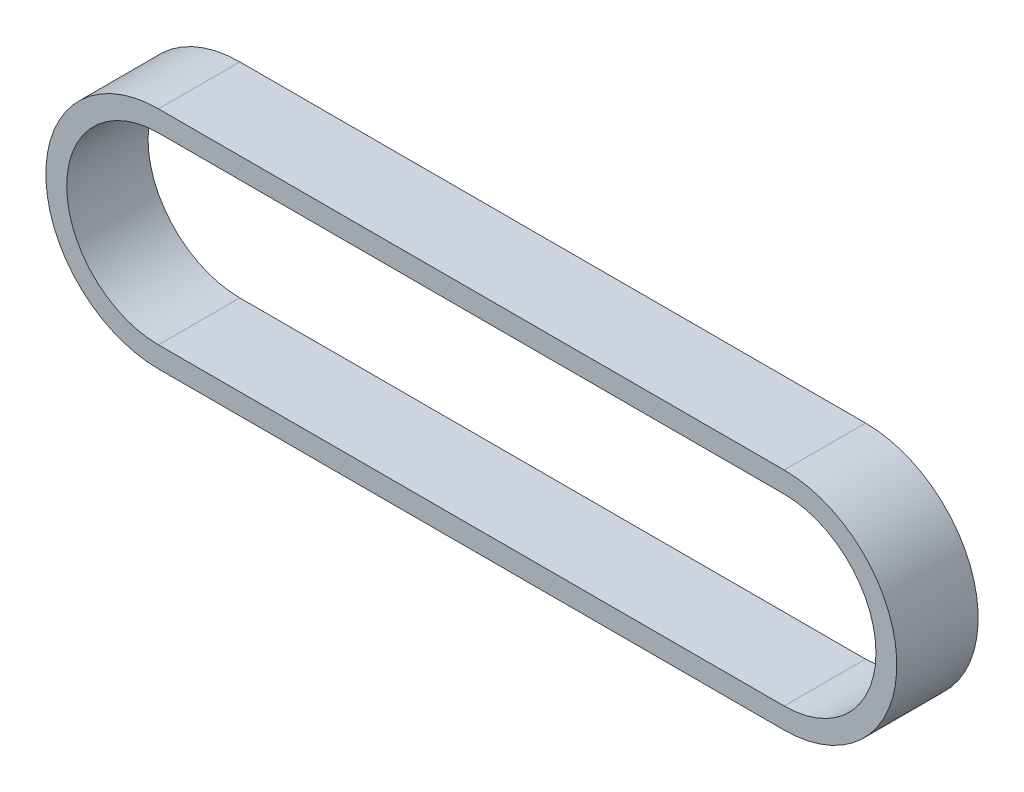
ISO-10303-21;
HEADER;
FILE_DESCRIPTION(('STEP AP214'),'2;1');
FILE_NAME('part.step','',(''),(''),'','','');
FILE_SCHEMA(('AUTOMOTIVE_DESIGN { 1 0 10303 214 1 1 1 1 }'));
ENDSEC;
DATA;
#1=APPLICATION_CONTEXT('core data for automotive mechanical design processes');
#2=APPLICATION_PROTOCOL_DEFINITION('international standard','automotive_design',2000,#1);
#3=PRODUCT_CONTEXT('',#1,'mechanical');
#4=PRODUCT('Part','Part','',(#3));
#5=PRODUCT_RELATED_PRODUCT_CATEGORY('part','',(#4));
#6=PRODUCT_DEFINITION_FORMATION('','',#4);
#7=PRODUCT_DEFINITION_CONTEXT('part definition',#1,'design');
#8=PRODUCT_DEFINITION('design','',#6,#7);
#9=PRODUCT_DEFINITION_SHAPE('','',#8);
#10=(LENGTH_UNIT() NAMED_UNIT(*) SI_UNIT(.MILLI.,.METRE.));
#11=(NAMED_UNIT(*) PLANE_ANGLE_UNIT() SI_UNIT($,.RADIAN.));
#12=(NAMED_UNIT(*) SI_UNIT($,.STERADIAN.) SOLID_ANGLE_UNIT());
#13=UNCERTAINTY_MEASURE_WITH_UNIT(LENGTH_MEASURE(1.E-05),#10,'distance_accuracy_value','');
#14=(GEOMETRIC_REPRESENTATION_CONTEXT(3) GLOBAL_UNCERTAINTY_ASSIGNED_CONTEXT((#13)) GLOBAL_UNIT_ASSIGNED_CONTEXT((#10,
#11,#12)) REPRESENTATION_CONTEXT('',''));
#15=CARTESIAN_POINT('',(0.,0.,0.));
#16=DIRECTION('',(0.,0.,1.));
#17=DIRECTION('',(1.,0.,0.));
#18=AXIS2_PLACEMENT_3D('',#15,#16,#17);
#19=CARTESIAN_POINT('',(-1.94289029309402E-13,-3.05311331771918E-13,19.5));
#20=DIRECTION('',(0.,0.,-1.));
#21=DIRECTION('',(-1.,0.,0.));
#22=AXIS2_PLACEMENT_3D('',#19,#20,#21);
#23=PLANE('',#22);
#24=CARTESIAN_POINT('',(-1.94289029309402E-13,-3.05311331771918E-13,19.5));
#25=DIRECTION('',(0.,0.,-1.));
#26=DIRECTION('',(-1.,0.,0.));
#27=AXIS2_PLACEMENT_3D('',#24,#25,#26);
#28=CIRCLE('',#27,54.);
#29=CARTESIAN_POINT('',(-0.00761184842954571,53.999999463516,19.5));
#30=VERTEX_POINT('',#29);
#31=CARTESIAN_POINT('',(0.0076118484290677,-53.9999994635167,19.5));
#32=VERTEX_POINT('',#31);
#33=EDGE_CURVE('E162',#30,#32,#28,.F.);
#34=ORIENTED_EDGE('',*,*,#33,.T.);
#35=DIRECTION('',(0.999999990065117,0.0001409601560991,0.));
#36=VECTOR('',#35,1.);
#37=CARTESIAN_POINT('',(0.00761184842915713,-53.9999994635167,19.5));
#38=LINE('',#37,#36);
#39=CARTESIAN_POINT('',(300.007608867957,-53.9577114166869,19.5));
#40=VERTEX_POINT('',#39);
#41=EDGE_CURVE('E165',#32,#40,#38,.T.);
#42=ORIENTED_EDGE('',*,*,#41,.T.);
#43=CARTESIAN_POINT('',(299.999997019527,0.0422880468294237,19.5));
#44=DIRECTION('',(0.,0.,-1.));
#45=DIRECTION('',(-1.,0.,0.));
#46=AXIS2_PLACEMENT_3D('',#43,#44,#45);
#47=CIRCLE('',#46,54.);
#48=CARTESIAN_POINT('',(299.992385171098,54.0422875103458,19.5));
#49=VERTEX_POINT('',#48);
#50=EDGE_CURVE('E168',#40,#49,#47,.F.);
#51=ORIENTED_EDGE('',*,*,#50,.T.);
#52=DIRECTION('',(-0.999999990065117,-0.0001409601560991,0.));
#53=VECTOR('',#52,1.);
#54=CARTESIAN_POINT('',(-0.00761184842954571,53.9999994635161,19.5));
#55=LINE('',#54,#53);
#56=EDGE_CURVE('E170',#49,#30,#55,.T.);
#57=ORIENTED_EDGE('',*,*,#56,.T.);
#58=EDGE_LOOP('',(#34,#42,#51,#57));
#59=FACE_BOUND('',#58,.T.);
#60=CARTESIAN_POINT('',(-1.94289029309402E-13,-3.05311331771918E-13,19.5));
#61=DIRECTION('',(0.,0.,1.));
#62=DIRECTION('',(-1.,0.,0.));
#63=AXIS2_PLACEMENT_3D('',#60,#61,#62);
#64=CIRCLE('',#63,44.);
#65=CARTESIAN_POINT('',(-0.0062022468685547,43.9999995628649,19.5));
#66=VERTEX_POINT('',#65);
#67=CARTESIAN_POINT('',(0.00620224686816612,-43.9999995628655,19.5));
#68=VERTEX_POINT('',#67);
#69=EDGE_CURVE('E126',#66,#68,#64,.T.);
#70=ORIENTED_EDGE('',*,*,#69,.F.);
#71=DIRECTION('',(-0.999999990065117,-0.0001409601560991,0.));
#72=VECTOR('',#71,1.);
#73=CARTESIAN_POINT('',(-0.0062022468685547,43.9999995628649,19.5));
#74=LINE('',#73,#72);
#75=CARTESIAN_POINT('',(299.993794772659,44.0422876096946,19.5));
#76=VERTEX_POINT('',#75);
#77=EDGE_CURVE('E148',#76,#66,#74,.T.);
#78=ORIENTED_EDGE('',*,*,#77,.F.);
#79=CARTESIAN_POINT('',(299.999997019527,0.0422880468294237,19.5));
#80=DIRECTION('',(0.,0.,1.));
#81=DIRECTION('',(-1.,0.,0.));
#82=AXIS2_PLACEMENT_3D('',#79,#80,#81);
#83=CIRCLE('',#82,44.);
#84=CARTESIAN_POINT('',(300.006199266396,-43.9577115160358,19.5));
#85=VERTEX_POINT('',#84);
#86=EDGE_CURVE('E146',#85,#76,#83,.T.);
#87=ORIENTED_EDGE('',*,*,#86,.F.);
#88=DIRECTION('',(0.999999990065117,0.0001409601560991,0.));
#89=VECTOR('',#88,1.);
#90=CARTESIAN_POINT('',(300.006199266396,-43.9577115160358,19.5));
#91=LINE('',#90,#89);
#92=EDGE_CURVE('E134',#68,#85,#91,.T.);
#93=ORIENTED_EDGE('',*,*,#92,.F.);
#94=EDGE_LOOP('',(#70,#78,#87,#93));
#95=FACE_BOUND('',#94,.T.);
#96=ADVANCED_FACE('F61',(#59,#95),#23,.F.);
#97=CARTESIAN_POINT('',(-1.94289029309402E-13,-3.05311331771918E-13,-19.5));
#98=DIRECTION('',(0.,0.,-1.));
#99=DIRECTION('',(-1.,0.,0.));
#100=AXIS2_PLACEMENT_3D('',#97,#98,#99);
#101=PLANE('',#100);
#102=CARTESIAN_POINT('',(-1.94289029309402E-13,-3.05311331771918E-13,-19.5));
#103=DIRECTION('',(0.,0.,-1.));
#104=DIRECTION('',(-1.,0.,0.));
#105=AXIS2_PLACEMENT_3D('',#102,#103,#104);
#106=CIRCLE('',#105,54.);
#107=CARTESIAN_POINT('',(-0.00761184842954571,53.999999463516,-19.5));
#108=VERTEX_POINT('',#107);
#109=CARTESIAN_POINT('',(0.0076118484290677,-53.9999994635167,-19.5));
#110=VERTEX_POINT('',#109);
#111=EDGE_CURVE('E142',#108,#110,#106,.F.);
#112=ORIENTED_EDGE('',*,*,#111,.F.);
#113=DIRECTION('',(-0.999999990065117,-0.0001409601560991,0.));
#114=VECTOR('',#113,1.);
#115=CARTESIAN_POINT('',(-0.00761184842954571,53.9999994635161,-19.5));
#116=LINE('',#115,#114);
#117=CARTESIAN_POINT('',(299.992385171098,54.0422875103458,-19.5));
#118=VERTEX_POINT('',#117);
#119=EDGE_CURVE('E166',#118,#108,#116,.T.);
#120=ORIENTED_EDGE('',*,*,#119,.F.);
#121=CARTESIAN_POINT('',(299.999997019527,0.0422880468294237,-19.5));
#122=DIRECTION('',(0.,0.,-1.));
#123=DIRECTION('',(-1.,0.,0.));
#124=AXIS2_PLACEMENT_3D('',#121,#122,#123);
#125=CIRCLE('',#124,54.);
#126=CARTESIAN_POINT('',(300.007608867957,-53.9577114166869,-19.5));
#127=VERTEX_POINT('',#126);
#128=EDGE_CURVE('E177',#127,#118,#125,.F.);
#129=ORIENTED_EDGE('',*,*,#128,.F.);
#130=DIRECTION('',(0.999999990065117,0.0001409601560991,0.));
#131=VECTOR('',#130,1.);
#132=CARTESIAN_POINT('',(0.00761184842915713,-53.9999994635167,-19.5));
#133=LINE('',#132,#131);
#134=EDGE_CURVE('E175',#110,#127,#133,.T.);
#135=ORIENTED_EDGE('',*,*,#134,.F.);
#136=EDGE_LOOP('',(#112,#120,#129,#135));
#137=FACE_BOUND('',#136,.T.);
#138=DIRECTION('',(-0.999999990065117,-0.0001409601560991,0.));
#139=VECTOR('',#138,1.);
#140=CARTESIAN_POINT('',(-0.0062022468685547,43.9999995628649,-19.5));
#141=LINE('',#140,#139);
#142=CARTESIAN_POINT('',(299.993794772659,44.0422876096946,-19.5));
#143=VERTEX_POINT('',#142);
#144=CARTESIAN_POINT('',(-0.0062022468685547,43.9999995628649,-19.5));
#145=VERTEX_POINT('',#144);
#146=EDGE_CURVE('E135',#143,#145,#141,.T.);
#147=ORIENTED_EDGE('',*,*,#146,.T.);
#148=CARTESIAN_POINT('',(-1.94289029309402E-13,-3.05311331771918E-13,-19.5));
#149=DIRECTION('',(0.,0.,1.));
#150=DIRECTION('',(-1.,0.,0.));
#151=AXIS2_PLACEMENT_3D('',#148,#149,#150);
#152=CIRCLE('',#151,44.);
#153=CARTESIAN_POINT('',(0.00620224686816612,-43.9999995628655,-19.5));
#154=VERTEX_POINT('',#153);
#155=EDGE_CURVE('E84',#145,#154,#152,.T.);
#156=ORIENTED_EDGE('',*,*,#155,.T.);
#157=DIRECTION('',(0.999999990065117,0.0001409601560991,0.));
#158=VECTOR('',#157,1.);
#159=CARTESIAN_POINT('',(300.006199266396,-43.9577115160358,-19.5));
#160=LINE('',#159,#158);
#161=CARTESIAN_POINT('',(300.006199266396,-43.9577115160358,-19.5));
#162=VERTEX_POINT('',#161);
#163=EDGE_CURVE('E141',#154,#162,#160,.T.);
#164=ORIENTED_EDGE('',*,*,#163,.T.);
#165=CARTESIAN_POINT('',(299.999997019527,0.0422880468294237,-19.5));
#166=DIRECTION('',(0.,0.,1.));
#167=DIRECTION('',(-1.,0.,0.));
#168=AXIS2_PLACEMENT_3D('',#165,#166,#167);
#169=CIRCLE('',#168,44.);
#170=EDGE_CURVE('E154',#162,#143,#169,.T.);
#171=ORIENTED_EDGE('',*,*,#170,.T.);
#172=EDGE_LOOP('',(#147,#156,#164,#171));
#173=FACE_BOUND('',#172,.T.);
#174=ADVANCED_FACE('F195',(#137,#173),#101,.T.);
#175=CARTESIAN_POINT('',(-1.94289029309402E-13,-3.05311331771918E-13,19.5));
#176=DIRECTION('',(0.,0.,-1.));
#177=DIRECTION('',(-1.,0.,0.));
#178=AXIS2_PLACEMENT_3D('',#175,#176,#177);
#179=CYLINDRICAL_SURFACE('',#178,54.);
#180=ORIENTED_EDGE('',*,*,#111,.T.);
#181=DIRECTION('',(0.,0.,-1.));
#182=VECTOR('',#181,1.);
#183=CARTESIAN_POINT('',(0.0076118484290677,-53.9999994635167,19.5));
#184=LINE('',#183,#182);
#185=EDGE_CURVE('E12',#32,#110,#184,.T.);
#186=ORIENTED_EDGE('',*,*,#185,.F.);
#187=ORIENTED_EDGE('',*,*,#33,.F.);
#188=DIRECTION('',(0.,0.,-1.));
#189=VECTOR('',#188,1.);
#190=CARTESIAN_POINT('',(-0.00761184842954571,53.999999463516,19.5));
#191=LINE('',#190,#189);
#192=EDGE_CURVE('E172',#30,#108,#191,.T.);
#193=ORIENTED_EDGE('',*,*,#192,.T.);
#194=EDGE_LOOP('',(#180,#186,#187,#193));
#195=FACE_BOUND('',#194,.T.);
#196=ADVANCED_FACE('F63',(#195),#179,.T.);
#197=CARTESIAN_POINT('',(0.00761184842915713,-53.9999994635167,19.5));
#198=DIRECTION('',(-0.0001409601560991,0.999999990065117,0.));
#199=DIRECTION('',(-0.999999990065117,-0.0001409601560991,0.));
#200=AXIS2_PLACEMENT_3D('',#197,#198,#199);
#201=PLANE('',#200);
#202=ORIENTED_EDGE('',*,*,#134,.T.);
#203=DIRECTION('',(0.,0.,-1.));
#204=VECTOR('',#203,1.);
#205=CARTESIAN_POINT('',(300.007608867957,-53.9577114166869,19.5));
#206=LINE('',#205,#204);
#207=EDGE_CURVE('E69',#40,#127,#206,.T.);
#208=ORIENTED_EDGE('',*,*,#207,.F.);
#209=ORIENTED_EDGE('',*,*,#41,.F.);
#210=ORIENTED_EDGE('',*,*,#185,.T.);
#211=EDGE_LOOP('',(#202,#208,#209,#210));
#212=FACE_BOUND('',#211,.T.);
#213=ADVANCED_FACE('F205',(#212),#201,.F.);
#214=CARTESIAN_POINT('',(299.999997019527,0.0422880468294237,19.5));
#215=DIRECTION('',(0.,0.,-1.));
#216=DIRECTION('',(-1.,0.,0.));
#217=AXIS2_PLACEMENT_3D('',#214,#215,#216);
#218=CYLINDRICAL_SURFACE('',#217,54.);
#219=ORIENTED_EDGE('',*,*,#128,.T.);
#220=DIRECTION('',(0.,0.,-1.));
#221=VECTOR('',#220,1.);
#222=CARTESIAN_POINT('',(299.992385171098,54.0422875103458,19.5));
#223=LINE('',#222,#221);
#224=EDGE_CURVE('E182',#49,#118,#223,.T.);
#225=ORIENTED_EDGE('',*,*,#224,.F.);
#226=ORIENTED_EDGE('',*,*,#50,.F.);
#227=ORIENTED_EDGE('',*,*,#207,.T.);
#228=EDGE_LOOP('',(#219,#225,#226,#227));
#229=FACE_BOUND('',#228,.T.);
#230=ADVANCED_FACE('F189',(#229),#218,.T.);
#231=CARTESIAN_POINT('',(-0.00761184842954571,53.9999994635161,19.5));
#232=DIRECTION('',(0.0001409601560991,-0.999999990065117,0.));
#233=DIRECTION('',(0.999999990065117,0.0001409601560991,0.));
#234=AXIS2_PLACEMENT_3D('',#231,#232,#233);
#235=PLANE('',#234);
#236=ORIENTED_EDGE('',*,*,#119,.T.);
#237=ORIENTED_EDGE('',*,*,#192,.F.);
#238=ORIENTED_EDGE('',*,*,#56,.F.);
#239=ORIENTED_EDGE('',*,*,#224,.T.);
#240=EDGE_LOOP('',(#236,#237,#238,#239));
#241=FACE_BOUND('',#240,.T.);
#242=ADVANCED_FACE('F199',(#241),#235,.F.);
#243=CARTESIAN_POINT('',(-1.94289029309402E-13,-3.05311331771918E-13,19.5));
#244=DIRECTION('',(0.,0.,-1.));
#245=DIRECTION('',(-1.,0.,0.));
#246=AXIS2_PLACEMENT_3D('',#243,#244,#245);
#247=CYLINDRICAL_SURFACE('',#246,44.);
#248=ORIENTED_EDGE('',*,*,#155,.F.);
#249=DIRECTION('',(0.,0.,-1.));
#250=VECTOR('',#249,1.);
#251=CARTESIAN_POINT('',(-0.0062022468685547,43.9999995628649,19.5));
#252=LINE('',#251,#250);
#253=EDGE_CURVE('E130',#66,#145,#252,.T.);
#254=ORIENTED_EDGE('',*,*,#253,.F.);
#255=ORIENTED_EDGE('',*,*,#69,.T.);
#256=DIRECTION('',(0.,0.,-1.));
#257=VECTOR('',#256,1.);
#258=CARTESIAN_POINT('',(0.00620224686816612,-43.9999995628655,19.5));
#259=LINE('',#258,#257);
#260=EDGE_CURVE('E129',#68,#154,#259,.T.);
#261=ORIENTED_EDGE('',*,*,#260,.T.);
#262=EDGE_LOOP('',(#248,#254,#255,#261));
#263=FACE_BOUND('',#262,.T.);
#264=ADVANCED_FACE('F128',(#263),#247,.F.);
#265=CARTESIAN_POINT('',(300.006199266396,-43.9577115160358,19.5));
#266=DIRECTION('',(-0.0001409601560991,0.999999990065117,0.));
#267=DIRECTION('',(-0.999999990065117,-0.0001409601560991,0.));
#268=AXIS2_PLACEMENT_3D('',#265,#266,#267);
#269=PLANE('',#268);
#270=ORIENTED_EDGE('',*,*,#163,.F.);
#271=ORIENTED_EDGE('',*,*,#260,.F.);
#272=ORIENTED_EDGE('',*,*,#92,.T.);
#273=DIRECTION('',(0.,0.,-1.));
#274=VECTOR('',#273,1.);
#275=CARTESIAN_POINT('',(300.006199266396,-43.9577115160358,19.5));
#276=LINE('',#275,#274);
#277=EDGE_CURVE('E143',#85,#162,#276,.T.);
#278=ORIENTED_EDGE('',*,*,#277,.T.);
#279=EDGE_LOOP('',(#270,#271,#272,#278));
#280=FACE_BOUND('',#279,.T.);
#281=ADVANCED_FACE('F138',(#280),#269,.T.);
#282=CARTESIAN_POINT('',(299.999997019527,0.0422880468294237,19.5));
#283=DIRECTION('',(0.,0.,-1.));
#284=DIRECTION('',(-1.,0.,0.));
#285=AXIS2_PLACEMENT_3D('',#282,#283,#284);
#286=CYLINDRICAL_SURFACE('',#285,44.);
#287=ORIENTED_EDGE('',*,*,#170,.F.);
#288=ORIENTED_EDGE('',*,*,#277,.F.);
#289=ORIENTED_EDGE('',*,*,#86,.T.);
#290=DIRECTION('',(0.,0.,-1.));
#291=VECTOR('',#290,1.);
#292=CARTESIAN_POINT('',(299.993794772659,44.0422876096946,19.5));
#293=LINE('',#292,#291);
#294=EDGE_CURVE('E76',#76,#143,#293,.T.);
#295=ORIENTED_EDGE('',*,*,#294,.T.);
#296=EDGE_LOOP('',(#287,#288,#289,#295));
#297=FACE_BOUND('',#296,.T.);
#298=ADVANCED_FACE('F228',(#297),#286,.F.);
#299=CARTESIAN_POINT('',(-0.0062022468685547,43.9999995628649,19.5));
#300=DIRECTION('',(0.0001409601560991,-0.999999990065117,0.));
#301=DIRECTION('',(0.999999990065117,0.0001409601560991,0.));
#302=AXIS2_PLACEMENT_3D('',#299,#300,#301);
#303=PLANE('',#302);
#304=ORIENTED_EDGE('',*,*,#146,.F.);
#305=ORIENTED_EDGE('',*,*,#294,.F.);
#306=ORIENTED_EDGE('',*,*,#77,.T.);
#307=ORIENTED_EDGE('',*,*,#253,.T.);
#308=EDGE_LOOP('',(#304,#305,#306,#307));
#309=FACE_BOUND('',#308,.T.);
#310=ADVANCED_FACE('F232',(#309),#303,.T.);
#311=CLOSED_SHELL('',(#96,#174,#196,#213,#230,#242,#264,#281,#298,#310));
#312=MANIFOLD_SOLID_BREP('B2',#311);
#313=ADVANCED_BREP_SHAPE_REPRESENTATION('',(#18,#312),#14);
#314=SHAPE_DEFINITION_REPRESENTATION(#9,#313);
ENDSEC;
END-ISO-10303-21;
